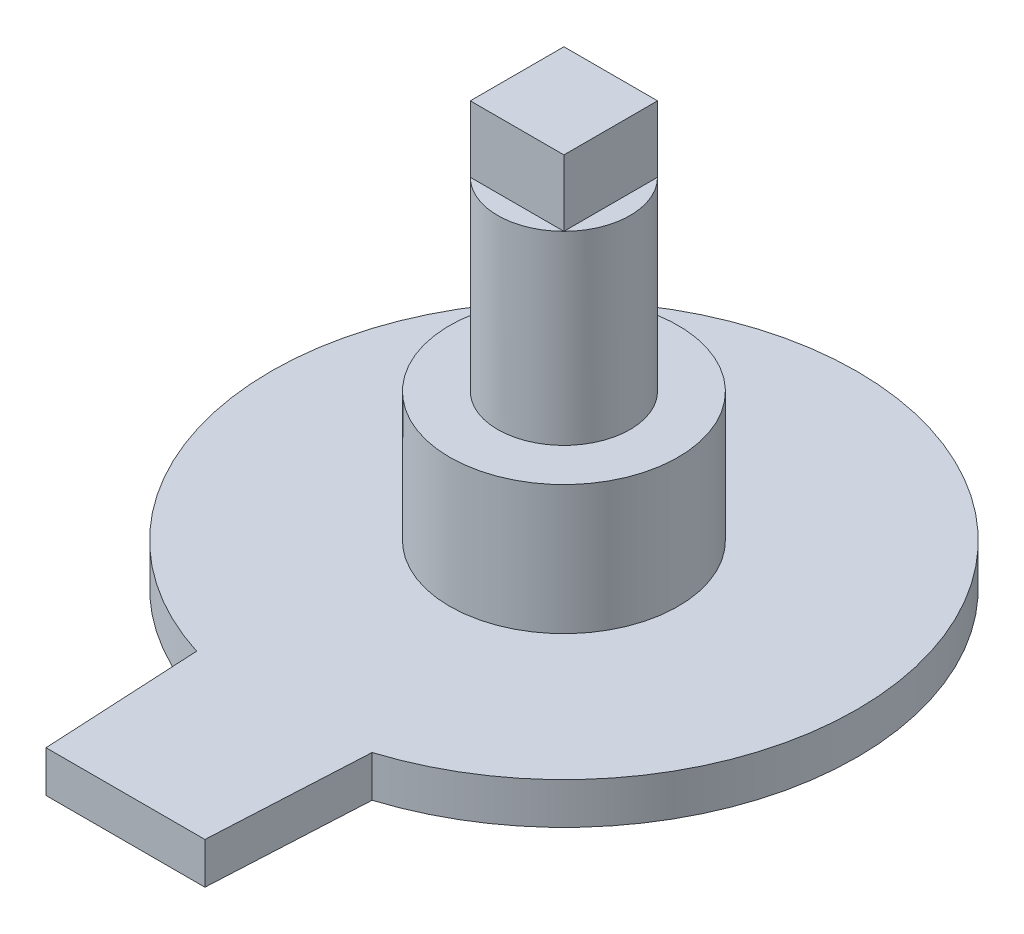
ISO-10303-21;
HEADER;
FILE_DESCRIPTION(('STEP AP214'),'2;1');
FILE_NAME('part.step','',(''),(''),'','','');
FILE_SCHEMA(('AUTOMOTIVE_DESIGN { 1 0 10303 214 1 1 1 1 }'));
ENDSEC;
DATA;
#1=APPLICATION_CONTEXT('core data for automotive mechanical design processes');
#2=APPLICATION_PROTOCOL_DEFINITION('international standard','automotive_design',2000,#1);
#3=PRODUCT_CONTEXT('',#1,'mechanical');
#4=PRODUCT('Part','Part','',(#3));
#5=PRODUCT_RELATED_PRODUCT_CATEGORY('part','',(#4));
#6=PRODUCT_DEFINITION_FORMATION('','',#4);
#7=PRODUCT_DEFINITION_CONTEXT('part definition',#1,'design');
#8=PRODUCT_DEFINITION('design','',#6,#7);
#9=PRODUCT_DEFINITION_SHAPE('','',#8);
#10=(LENGTH_UNIT() NAMED_UNIT(*) SI_UNIT(.MILLI.,.METRE.));
#11=(NAMED_UNIT(*) PLANE_ANGLE_UNIT() SI_UNIT($,.RADIAN.));
#12=(NAMED_UNIT(*) SI_UNIT($,.STERADIAN.) SOLID_ANGLE_UNIT());
#13=UNCERTAINTY_MEASURE_WITH_UNIT(LENGTH_MEASURE(1.E-05),#10,'distance_accuracy_value','');
#14=(GEOMETRIC_REPRESENTATION_CONTEXT(3) GLOBAL_UNCERTAINTY_ASSIGNED_CONTEXT((#13)) GLOBAL_UNIT_ASSIGNED_CONTEXT((#10,
#11,#12)) REPRESENTATION_CONTEXT('',''));
#15=CARTESIAN_POINT('',(0.,0.,0.));
#16=DIRECTION('',(0.,0.,1.));
#17=DIRECTION('',(1.,0.,0.));
#18=AXIS2_PLACEMENT_3D('',#15,#16,#17);
#19=CARTESIAN_POINT('',(0.,1.25,0.));
#20=DIRECTION('',(0.,-1.,0.));
#21=DIRECTION('',(0.,0.,-1.));
#22=AXIS2_PLACEMENT_3D('',#19,#20,#21);
#23=CYLINDRICAL_SURFACE('',#22,8.85);
#24=DIRECTION('',(0.,-1.,0.));
#25=VECTOR('',#24,1.);
#26=CARTESIAN_POINT('',(2.65,1.25,8.44393273303382));
#27=LINE('',#26,#25);
#28=CARTESIAN_POINT('',(2.65,1.25,8.44393273303382));
#29=VERTEX_POINT('',#28);
#30=CARTESIAN_POINT('',(2.65,0.,8.44393273303382));
#31=VERTEX_POINT('',#30);
#32=EDGE_CURVE('E147',#29,#31,#27,.T.);
#33=ORIENTED_EDGE('',*,*,#32,.T.);
#34=CARTESIAN_POINT('',(0.,0.,0.));
#35=DIRECTION('',(0.,1.,0.));
#36=DIRECTION('',(0.,0.,1.));
#37=AXIS2_PLACEMENT_3D('',#34,#35,#36);
#38=CIRCLE('',#37,8.85);
#39=CARTESIAN_POINT('',(-2.65,0.,8.44393273303382));
#40=VERTEX_POINT('',#39);
#41=EDGE_CURVE('E44',#31,#40,#38,.T.);
#42=ORIENTED_EDGE('',*,*,#41,.T.);
#43=DIRECTION('',(0.,-1.,0.));
#44=VECTOR('',#43,1.);
#45=CARTESIAN_POINT('',(-2.65,1.25,8.44393273303382));
#46=LINE('',#45,#44);
#47=CARTESIAN_POINT('',(-2.65,1.25,8.44393273303382));
#48=VERTEX_POINT('',#47);
#49=EDGE_CURVE('E58',#48,#40,#46,.T.);
#50=ORIENTED_EDGE('',*,*,#49,.F.);
#51=CARTESIAN_POINT('',(0.,1.25,0.));
#52=DIRECTION('',(0.,1.,0.));
#53=DIRECTION('',(0.,0.,1.));
#54=AXIS2_PLACEMENT_3D('',#51,#52,#53);
#55=CIRCLE('',#54,8.85);
#56=EDGE_CURVE('E62',#29,#48,#55,.T.);
#57=ORIENTED_EDGE('',*,*,#56,.F.);
#58=EDGE_LOOP('',(#33,#42,#50,#57));
#59=FACE_BOUND('',#58,.T.);
#60=ADVANCED_FACE('F41',(#59),#23,.T.);
#61=CARTESIAN_POINT('',(0.,10.75,0.));
#62=DIRECTION('',(0.,1.,0.));
#63=DIRECTION('',(0.,0.,1.));
#64=AXIS2_PLACEMENT_3D('',#61,#62,#63);
#65=PLANE('',#64);
#66=DIRECTION('',(0.,0.,-1.));
#67=VECTOR('',#66,1.);
#68=CARTESIAN_POINT('',(1.4142135623731,10.75,1.41421356237309));
#69=LINE('',#68,#67);
#70=CARTESIAN_POINT('',(1.41421356237309,10.75,1.41421356237309));
#71=VERTEX_POINT('',#70);
#72=CARTESIAN_POINT('',(1.41421356237309,10.75,-1.41421356237309));
#73=VERTEX_POINT('',#72);
#74=EDGE_CURVE('E146',#71,#73,#69,.T.);
#75=ORIENTED_EDGE('',*,*,#74,.F.);
#76=CARTESIAN_POINT('',(0.,10.75,0.));
#77=DIRECTION('',(0.,1.,0.));
#78=DIRECTION('',(0.,0.,1.));
#79=AXIS2_PLACEMENT_3D('',#76,#77,#78);
#80=CIRCLE('',#79,2.);
#81=EDGE_CURVE('E197',#71,#73,#80,.T.);
#82=ORIENTED_EDGE('',*,*,#81,.T.);
#83=EDGE_LOOP('',(#75,#82));
#84=FACE_BOUND('',#83,.T.);
#85=ADVANCED_FACE('F225',(#84),#65,.T.);
#86=DIRECTION('',(1.,0.,0.));
#87=VECTOR('',#86,1.);
#88=CARTESIAN_POINT('',(-1.41421356237309,10.75,1.41421356237309));
#89=LINE('',#88,#87);
#90=CARTESIAN_POINT('',(-1.41421356237309,10.75,1.4142135623731));
#91=VERTEX_POINT('',#90);
#92=EDGE_CURVE('E157',#91,#71,#89,.T.);
#93=ORIENTED_EDGE('',*,*,#92,.F.);
#94=EDGE_CURVE('E196',#91,#71,#80,.T.);
#95=ORIENTED_EDGE('',*,*,#94,.T.);
#96=EDGE_LOOP('',(#93,#95));
#97=FACE_BOUND('',#96,.T.);
#98=ADVANCED_FACE('F229',(#97),#65,.T.);
#99=DIRECTION('',(0.,0.,1.));
#100=VECTOR('',#99,1.);
#101=CARTESIAN_POINT('',(-1.41421356237309,10.75,1.41421356237309));
#102=LINE('',#101,#100);
#103=CARTESIAN_POINT('',(-1.41421356237309,10.75,-1.41421356237309));
#104=VERTEX_POINT('',#103);
#105=EDGE_CURVE('E174',#104,#91,#102,.T.);
#106=ORIENTED_EDGE('',*,*,#105,.F.);
#107=EDGE_CURVE('E262',#104,#91,#80,.T.);
#108=ORIENTED_EDGE('',*,*,#107,.T.);
#109=EDGE_LOOP('',(#106,#108));
#110=FACE_BOUND('',#109,.T.);
#111=ADVANCED_FACE('F236',(#110),#65,.T.);
#112=CARTESIAN_POINT('',(0.,1.25,0.));
#113=DIRECTION('',(0.,1.,0.));
#114=DIRECTION('',(0.,0.,1.));
#115=AXIS2_PLACEMENT_3D('',#112,#113,#114);
#116=PLANE('',#115);
#117=CARTESIAN_POINT('',(0.,1.25,0.));
#118=DIRECTION('',(0.,1.,0.));
#119=DIRECTION('',(0.,0.,1.));
#120=AXIS2_PLACEMENT_3D('',#117,#118,#119);
#121=CIRCLE('',#120,3.45);
#122=CARTESIAN_POINT('',(0.,1.25,3.45));
#123=VERTEX_POINT('',#122);
#124=EDGE_CURVE('E50',#123,#123,#121,.T.);
#125=ORIENTED_EDGE('',*,*,#124,.F.);
#126=EDGE_LOOP('',(#125));
#127=FACE_BOUND('',#126,.T.);
#128=ORIENTED_EDGE('',*,*,#56,.T.);
#129=DIRECTION('',(0.0520128341898724,0.,0.998646416445549));
#130=VECTOR('',#129,1.);
#131=CARTESIAN_POINT('',(-3.08142925136416,1.25,0.160491106841884));
#132=LINE('',#131,#130);
#133=CARTESIAN_POINT('',(-2.4,1.25,13.2439327330338));
#134=VERTEX_POINT('',#133);
#135=EDGE_CURVE('E107',#48,#134,#132,.T.);
#136=ORIENTED_EDGE('',*,*,#135,.T.);
#137=DIRECTION('',(1.,0.,0.));
#138=VECTOR('',#137,1.);
#139=CARTESIAN_POINT('',(0.,1.25,13.2439327330338));
#140=LINE('',#139,#138);
#141=CARTESIAN_POINT('',(2.4,1.25,13.2439327330338));
#142=VERTEX_POINT('',#141);
#143=EDGE_CURVE('E111',#134,#142,#140,.T.);
#144=ORIENTED_EDGE('',*,*,#143,.T.);
#145=DIRECTION('',(0.0520128341898724,0.,-0.998646416445549));
#146=VECTOR('',#145,1.);
#147=CARTESIAN_POINT('',(3.08142925136416,1.25,0.160491106841884));
#148=LINE('',#147,#146);
#149=EDGE_CURVE('E115',#142,#29,#148,.T.);
#150=ORIENTED_EDGE('',*,*,#149,.T.);
#151=EDGE_LOOP('',(#128,#136,#144,#150));
#152=FACE_BOUND('',#151,.T.);
#153=ADVANCED_FACE('F109',(#127,#152),#116,.T.);
#154=CARTESIAN_POINT('',(0.,0.,0.));
#155=DIRECTION('',(0.,1.,0.));
#156=DIRECTION('',(0.,0.,1.));
#157=AXIS2_PLACEMENT_3D('',#154,#155,#156);
#158=PLANE('',#157);
#159=ORIENTED_EDGE('',*,*,#41,.F.);
#160=DIRECTION('',(0.0520128341898724,0.,-0.998646416445549));
#161=VECTOR('',#160,1.);
#162=CARTESIAN_POINT('',(3.08142925136416,0.,0.160491106841884));
#163=LINE('',#162,#161);
#164=CARTESIAN_POINT('',(2.4,0.,13.2439327330338));
#165=VERTEX_POINT('',#164);
#166=EDGE_CURVE('E131',#165,#31,#163,.T.);
#167=ORIENTED_EDGE('',*,*,#166,.F.);
#168=DIRECTION('',(1.,0.,0.));
#169=VECTOR('',#168,1.);
#170=CARTESIAN_POINT('',(0.,0.,13.2439327330338));
#171=LINE('',#170,#169);
#172=CARTESIAN_POINT('',(-2.4,0.,13.2439327330338));
#173=VERTEX_POINT('',#172);
#174=EDGE_CURVE('E139',#173,#165,#171,.T.);
#175=ORIENTED_EDGE('',*,*,#174,.F.);
#176=DIRECTION('',(0.0520128341898724,0.,0.998646416445549));
#177=VECTOR('',#176,1.);
#178=CARTESIAN_POINT('',(-3.08142925136416,0.,0.160491106841884));
#179=LINE('',#178,#177);
#180=EDGE_CURVE('E121',#40,#173,#179,.T.);
#181=ORIENTED_EDGE('',*,*,#180,.F.);
#182=EDGE_LOOP('',(#159,#167,#175,#181));
#183=FACE_BOUND('',#182,.T.);
#184=ADVANCED_FACE('F212',(#183),#158,.F.);
#185=CARTESIAN_POINT('',(0.,5.15,0.));
#186=DIRECTION('',(0.,-1.,0.));
#187=DIRECTION('',(0.,0.,-1.));
#188=AXIS2_PLACEMENT_3D('',#185,#186,#187);
#189=CYLINDRICAL_SURFACE('',#188,3.45);
#190=CARTESIAN_POINT('',(0.,5.15,0.));
#191=DIRECTION('',(0.,1.,0.));
#192=DIRECTION('',(0.,0.,1.));
#193=AXIS2_PLACEMENT_3D('',#190,#191,#192);
#194=CIRCLE('',#193,3.45);
#195=CARTESIAN_POINT('',(0.,5.15,3.45));
#196=VERTEX_POINT('',#195);
#197=EDGE_CURVE('E200',#196,#196,#194,.T.);
#198=ORIENTED_EDGE('',*,*,#197,.F.);
#199=EDGE_LOOP('',(#198));
#200=FACE_BOUND('',#199,.T.);
#201=ORIENTED_EDGE('',*,*,#124,.T.);
#202=EDGE_LOOP('',(#201));
#203=FACE_BOUND('',#202,.T.);
#204=ADVANCED_FACE('F331',(#200,#203),#189,.T.);
#205=CARTESIAN_POINT('',(0.,5.15,0.));
#206=DIRECTION('',(0.,1.,0.));
#207=DIRECTION('',(0.,0.,1.));
#208=AXIS2_PLACEMENT_3D('',#205,#206,#207);
#209=PLANE('',#208);
#210=CARTESIAN_POINT('',(0.,5.15,0.));
#211=DIRECTION('',(0.,1.,0.));
#212=DIRECTION('',(0.,0.,1.));
#213=AXIS2_PLACEMENT_3D('',#210,#211,#212);
#214=CIRCLE('',#213,2.);
#215=CARTESIAN_POINT('',(0.,5.15,2.));
#216=VERTEX_POINT('',#215);
#217=EDGE_CURVE('E11',#216,#216,#214,.T.);
#218=ORIENTED_EDGE('',*,*,#217,.F.);
#219=EDGE_LOOP('',(#218));
#220=FACE_BOUND('',#219,.T.);
#221=ORIENTED_EDGE('',*,*,#197,.T.);
#222=EDGE_LOOP('',(#221));
#223=FACE_BOUND('',#222,.T.);
#224=ADVANCED_FACE('F250',(#220,#223),#209,.T.);
#225=CARTESIAN_POINT('',(0.,10.75,0.));
#226=DIRECTION('',(0.,-1.,0.));
#227=DIRECTION('',(0.,0.,-1.));
#228=AXIS2_PLACEMENT_3D('',#225,#226,#227);
#229=CYLINDRICAL_SURFACE('',#228,2.);
#230=ORIENTED_EDGE('',*,*,#81,.F.);
#231=ORIENTED_EDGE('',*,*,#94,.F.);
#232=ORIENTED_EDGE('',*,*,#107,.F.);
#233=EDGE_CURVE('E201',#73,#104,#80,.T.);
#234=ORIENTED_EDGE('',*,*,#233,.F.);
#235=EDGE_LOOP('',(#230,#231,#232,#234));
#236=FACE_BOUND('',#235,.T.);
#237=ORIENTED_EDGE('',*,*,#217,.T.);
#238=EDGE_LOOP('',(#237));
#239=FACE_BOUND('',#238,.T.);
#240=ADVANCED_FACE('F242',(#236,#239),#229,.T.);
#241=DIRECTION('',(-1.,0.,0.));
#242=VECTOR('',#241,1.);
#243=CARTESIAN_POINT('',(-1.41421356237309,10.75,-1.41421356237309));
#244=LINE('',#243,#242);
#245=EDGE_CURVE('E170',#73,#104,#244,.T.);
#246=ORIENTED_EDGE('',*,*,#245,.F.);
#247=ORIENTED_EDGE('',*,*,#233,.T.);
#248=EDGE_LOOP('',(#246,#247));
#249=FACE_BOUND('',#248,.T.);
#250=ADVANCED_FACE('F232',(#249),#65,.T.);
#251=CARTESIAN_POINT('',(1.4142135623731,12.75,1.41421356237309));
#252=DIRECTION('',(-1.,0.,0.));
#253=DIRECTION('',(0.,0.,1.));
#254=AXIS2_PLACEMENT_3D('',#251,#252,#253);
#255=PLANE('',#254);
#256=ORIENTED_EDGE('',*,*,#74,.T.);
#257=DIRECTION('',(0.,-1.,0.));
#258=VECTOR('',#257,1.);
#259=CARTESIAN_POINT('',(1.4142135623731,12.75,-1.41421356237309));
#260=LINE('',#259,#258);
#261=CARTESIAN_POINT('',(1.4142135623731,12.75,-1.41421356237309));
#262=VERTEX_POINT('',#261);
#263=EDGE_CURVE('E192',#262,#73,#260,.T.);
#264=ORIENTED_EDGE('',*,*,#263,.F.);
#265=DIRECTION('',(0.,0.,-1.));
#266=VECTOR('',#265,1.);
#267=CARTESIAN_POINT('',(1.4142135623731,12.75,1.41421356237309));
#268=LINE('',#267,#266);
#269=CARTESIAN_POINT('',(1.4142135623731,12.75,1.41421356237309));
#270=VERTEX_POINT('',#269);
#271=EDGE_CURVE('E152',#270,#262,#268,.T.);
#272=ORIENTED_EDGE('',*,*,#271,.F.);
#273=DIRECTION('',(0.,-1.,0.));
#274=VECTOR('',#273,1.);
#275=CARTESIAN_POINT('',(1.4142135623731,12.75,1.41421356237309));
#276=LINE('',#275,#274);
#277=EDGE_CURVE('E166',#270,#71,#276,.T.);
#278=ORIENTED_EDGE('',*,*,#277,.T.);
#279=EDGE_LOOP('',(#256,#264,#272,#278));
#280=FACE_BOUND('',#279,.T.);
#281=ADVANCED_FACE('F241',(#280),#255,.F.);
#282=CARTESIAN_POINT('',(-1.41421356237309,12.75,-1.41421356237309));
#283=DIRECTION('',(0.,0.,1.));
#284=DIRECTION('',(1.,0.,0.));
#285=AXIS2_PLACEMENT_3D('',#282,#283,#284);
#286=PLANE('',#285);
#287=ORIENTED_EDGE('',*,*,#245,.T.);
#288=DIRECTION('',(0.,-1.,0.));
#289=VECTOR('',#288,1.);
#290=CARTESIAN_POINT('',(-1.41421356237309,12.75,-1.41421356237309));
#291=LINE('',#290,#289);
#292=CARTESIAN_POINT('',(-1.41421356237309,12.75,-1.41421356237309));
#293=VERTEX_POINT('',#292);
#294=EDGE_CURVE('E188',#293,#104,#291,.T.);
#295=ORIENTED_EDGE('',*,*,#294,.F.);
#296=DIRECTION('',(-1.,0.,0.));
#297=VECTOR('',#296,1.);
#298=CARTESIAN_POINT('',(-1.41421356237309,12.75,-1.41421356237309));
#299=LINE('',#298,#297);
#300=EDGE_CURVE('E156',#262,#293,#299,.T.);
#301=ORIENTED_EDGE('',*,*,#300,.F.);
#302=ORIENTED_EDGE('',*,*,#263,.T.);
#303=EDGE_LOOP('',(#287,#295,#301,#302));
#304=FACE_BOUND('',#303,.T.);
#305=ADVANCED_FACE('F248',(#304),#286,.F.);
#306=CARTESIAN_POINT('',(-1.41421356237309,12.75,1.41421356237309));
#307=DIRECTION('',(1.,0.,0.));
#308=DIRECTION('',(0.,0.,-1.));
#309=AXIS2_PLACEMENT_3D('',#306,#307,#308);
#310=PLANE('',#309);
#311=ORIENTED_EDGE('',*,*,#105,.T.);
#312=DIRECTION('',(0.,-1.,0.));
#313=VECTOR('',#312,1.);
#314=CARTESIAN_POINT('',(-1.41421356237309,12.75,1.41421356237309));
#315=LINE('',#314,#313);
#316=CARTESIAN_POINT('',(-1.41421356237309,12.75,1.41421356237309));
#317=VERTEX_POINT('',#316);
#318=EDGE_CURVE('E184',#317,#91,#315,.T.);
#319=ORIENTED_EDGE('',*,*,#318,.F.);
#320=DIRECTION('',(0.,0.,1.));
#321=VECTOR('',#320,1.);
#322=CARTESIAN_POINT('',(-1.41421356237309,12.75,1.41421356237309));
#323=LINE('',#322,#321);
#324=EDGE_CURVE('E160',#293,#317,#323,.T.);
#325=ORIENTED_EDGE('',*,*,#324,.F.);
#326=ORIENTED_EDGE('',*,*,#294,.T.);
#327=EDGE_LOOP('',(#311,#319,#325,#326));
#328=FACE_BOUND('',#327,.T.);
#329=ADVANCED_FACE('F270',(#328),#310,.F.);
#330=CARTESIAN_POINT('',(-1.41421356237309,12.75,1.41421356237309));
#331=DIRECTION('',(0.,0.,-1.));
#332=DIRECTION('',(-1.,0.,0.));
#333=AXIS2_PLACEMENT_3D('',#330,#331,#332);
#334=PLANE('',#333);
#335=ORIENTED_EDGE('',*,*,#92,.T.);
#336=ORIENTED_EDGE('',*,*,#277,.F.);
#337=DIRECTION('',(1.,0.,0.));
#338=VECTOR('',#337,1.);
#339=CARTESIAN_POINT('',(-1.41421356237309,12.75,1.41421356237309));
#340=LINE('',#339,#338);
#341=EDGE_CURVE('E163',#317,#270,#340,.T.);
#342=ORIENTED_EDGE('',*,*,#341,.F.);
#343=ORIENTED_EDGE('',*,*,#318,.T.);
#344=EDGE_LOOP('',(#335,#336,#342,#343));
#345=FACE_BOUND('',#344,.T.);
#346=ADVANCED_FACE('F281',(#345),#334,.F.);
#347=CARTESIAN_POINT('',(0.,12.75,0.));
#348=DIRECTION('',(0.,-1.,0.));
#349=DIRECTION('',(0.,0.,-1.));
#350=AXIS2_PLACEMENT_3D('',#347,#348,#349);
#351=PLANE('',#350);
#352=ORIENTED_EDGE('',*,*,#271,.T.);
#353=ORIENTED_EDGE('',*,*,#300,.T.);
#354=ORIENTED_EDGE('',*,*,#324,.T.);
#355=ORIENTED_EDGE('',*,*,#341,.T.);
#356=EDGE_LOOP('',(#352,#353,#354,#355));
#357=FACE_BOUND('',#356,.T.);
#358=ADVANCED_FACE('F222',(#357),#351,.F.);
#359=CARTESIAN_POINT('',(0.,1.25,13.2439327330338));
#360=DIRECTION('',(0.,0.,-1.));
#361=DIRECTION('',(-1.,0.,0.));
#362=AXIS2_PLACEMENT_3D('',#359,#360,#361);
#363=PLANE('',#362);
#364=ORIENTED_EDGE('',*,*,#174,.T.);
#365=DIRECTION('',(0.,-1.,0.));
#366=VECTOR('',#365,1.);
#367=CARTESIAN_POINT('',(2.4,1.25,13.2439327330338));
#368=LINE('',#367,#366);
#369=EDGE_CURVE('E129',#142,#165,#368,.T.);
#370=ORIENTED_EDGE('',*,*,#369,.F.);
#371=ORIENTED_EDGE('',*,*,#143,.F.);
#372=DIRECTION('',(0.,-1.,0.));
#373=VECTOR('',#372,1.);
#374=CARTESIAN_POINT('',(-2.4,1.25,13.2439327330338));
#375=LINE('',#374,#373);
#376=EDGE_CURVE('E118',#134,#173,#375,.T.);
#377=ORIENTED_EDGE('',*,*,#376,.T.);
#378=EDGE_LOOP('',(#364,#370,#371,#377));
#379=FACE_BOUND('',#378,.T.);
#380=ADVANCED_FACE('F127',(#379),#363,.F.);
#381=CARTESIAN_POINT('',(3.08142925136416,1.25,0.160491106841884));
#382=DIRECTION('',(-0.998646416445549,0.,-0.0520128341898724));
#383=DIRECTION('',(-0.0520128341898724,0.,0.998646416445549));
#384=AXIS2_PLACEMENT_3D('',#381,#382,#383);
#385=PLANE('',#384);
#386=ORIENTED_EDGE('',*,*,#166,.T.);
#387=ORIENTED_EDGE('',*,*,#32,.F.);
#388=ORIENTED_EDGE('',*,*,#149,.F.);
#389=ORIENTED_EDGE('',*,*,#369,.T.);
#390=EDGE_LOOP('',(#386,#387,#388,#389));
#391=FACE_BOUND('',#390,.T.);
#392=ADVANCED_FACE('F214',(#391),#385,.F.);
#393=CARTESIAN_POINT('',(-3.08142925136416,1.25,0.160491106841884));
#394=DIRECTION('',(0.998646416445549,0.,-0.0520128341898724));
#395=DIRECTION('',(-0.0520128341898724,0.,-0.998646416445549));
#396=AXIS2_PLACEMENT_3D('',#393,#394,#395);
#397=PLANE('',#396);
#398=ORIENTED_EDGE('',*,*,#180,.T.);
#399=ORIENTED_EDGE('',*,*,#376,.F.);
#400=ORIENTED_EDGE('',*,*,#135,.F.);
#401=ORIENTED_EDGE('',*,*,#49,.T.);
#402=EDGE_LOOP('',(#398,#399,#400,#401));
#403=FACE_BOUND('',#402,.T.);
#404=ADVANCED_FACE('F119',(#403),#397,.F.);
#405=CLOSED_SHELL('',(#60,#85,#98,#111,#153,#184,#204,#224,#240,#250,#281,#305,#329,#346,#358,
#380,#392,#404));
#406=MANIFOLD_SOLID_BREP('B2',#405);
#407=ADVANCED_BREP_SHAPE_REPRESENTATION('',(#18,#406),#14);
#408=SHAPE_DEFINITION_REPRESENTATION(#9,#407);
ENDSEC;
END-ISO-10303-21;
